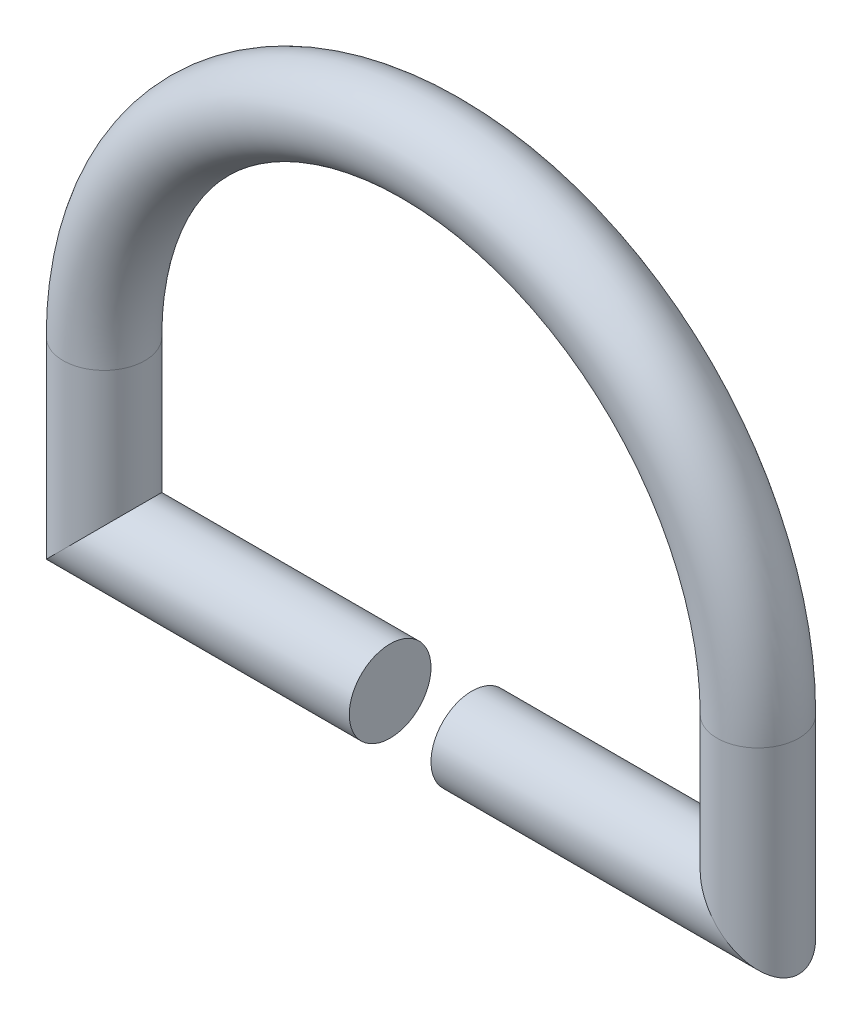
ISO-10303-21;
HEADER;
FILE_DESCRIPTION(('STEP AP214'),'2;1');
FILE_NAME('part.step','',(''),(''),'','','');
FILE_SCHEMA(('AUTOMOTIVE_DESIGN { 1 0 10303 214 1 1 1 1 }'));
ENDSEC;
DATA;
#1=APPLICATION_CONTEXT('core data for automotive mechanical design processes');
#2=APPLICATION_PROTOCOL_DEFINITION('international standard','automotive_design',2000,#1);
#3=PRODUCT_CONTEXT('',#1,'mechanical');
#4=PRODUCT('Part','Part','',(#3));
#5=PRODUCT_RELATED_PRODUCT_CATEGORY('part','',(#4));
#6=PRODUCT_DEFINITION_FORMATION('','',#4);
#7=PRODUCT_DEFINITION_CONTEXT('part definition',#1,'design');
#8=PRODUCT_DEFINITION('design','',#6,#7);
#9=PRODUCT_DEFINITION_SHAPE('','',#8);
#10=(LENGTH_UNIT() NAMED_UNIT(*) SI_UNIT(.MILLI.,.METRE.));
#11=(NAMED_UNIT(*) PLANE_ANGLE_UNIT() SI_UNIT($,.RADIAN.));
#12=(NAMED_UNIT(*) SI_UNIT($,.STERADIAN.) SOLID_ANGLE_UNIT());
#13=UNCERTAINTY_MEASURE_WITH_UNIT(LENGTH_MEASURE(1.E-05),#10,'distance_accuracy_value','');
#14=(GEOMETRIC_REPRESENTATION_CONTEXT(3) GLOBAL_UNCERTAINTY_ASSIGNED_CONTEXT((#13)) GLOBAL_UNIT_ASSIGNED_CONTEXT((#10,
#11,#12)) REPRESENTATION_CONTEXT('',''));
#15=CARTESIAN_POINT('',(0.,0.,0.));
#16=DIRECTION('',(0.,0.,1.));
#17=DIRECTION('',(1.,0.,0.));
#18=AXIS2_PLACEMENT_3D('',#15,#16,#17);
#19=CARTESIAN_POINT('',(-0.5,0.,0.));
#20=DIRECTION('',(1.,0.,0.));
#21=DIRECTION('',(0.,0.,-1.));
#22=AXIS2_PLACEMENT_3D('',#19,#20,#21);
#23=PLANE('',#22);
#24=CARTESIAN_POINT('',(-0.5,0.,0.));
#25=DIRECTION('',(1.,0.,0.));
#26=DIRECTION('',(0.,0.,-1.));
#27=AXIS2_PLACEMENT_3D('',#24,#25,#26);
#28=CIRCLE('',#27,0.5);
#29=CARTESIAN_POINT('',(-0.5,0.,-0.5));
#30=VERTEX_POINT('',#29);
#31=EDGE_CURVE('E46',#30,#30,#28,.T.);
#32=ORIENTED_EDGE('',*,*,#31,.T.);
#33=EDGE_LOOP('',(#32));
#34=FACE_BOUND('',#33,.T.);
#35=ADVANCED_FACE('F43',(#34),#23,.T.);
#36=CARTESIAN_POINT('',(0.5,0.,0.));
#37=DIRECTION('',(1.,0.,0.));
#38=DIRECTION('',(0.,0.,-1.));
#39=AXIS2_PLACEMENT_3D('',#36,#37,#38);
#40=PLANE('',#39);
#41=CARTESIAN_POINT('',(0.5,0.,0.));
#42=DIRECTION('',(1.,0.,0.));
#43=DIRECTION('',(0.,0.,-1.));
#44=AXIS2_PLACEMENT_3D('',#41,#42,#43);
#45=CIRCLE('',#44,0.5);
#46=CARTESIAN_POINT('',(0.5,0.,-0.5));
#47=VERTEX_POINT('',#46);
#48=EDGE_CURVE('E51',#47,#47,#45,.T.);
#49=ORIENTED_EDGE('',*,*,#48,.F.);
#50=EDGE_LOOP('',(#49));
#51=FACE_BOUND('',#50,.T.);
#52=ADVANCED_FACE('F79',(#51),#40,.F.);
#53=CARTESIAN_POINT('',(-5.2,0.,0.));
#54=DIRECTION('',(1.,0.,0.));
#55=DIRECTION('',(0.,0.,-1.));
#56=AXIS2_PLACEMENT_3D('',#53,#54,#55);
#57=CYLINDRICAL_SURFACE('',#56,0.5);
#58=CARTESIAN_POINT('',(-4.,0.,0.));
#59=DIRECTION('',(0.707106781186548,-0.707106781186548,0.));
#60=DIRECTION('',(-0.707106781186548,-0.707106781186548,0.));
#61=AXIS2_PLACEMENT_3D('',#58,#59,#60);
#62=ELLIPSE('',#61,0.707106781186547,0.5);
#63=CARTESIAN_POINT('',(-4.5,-0.499999999999999,0.));
#64=VERTEX_POINT('',#63);
#65=EDGE_CURVE('E64',#64,#64,#62,.F.);
#66=ORIENTED_EDGE('',*,*,#65,.F.);
#67=EDGE_LOOP('',(#66));
#68=FACE_BOUND('',#67,.T.);
#69=ORIENTED_EDGE('',*,*,#31,.F.);
#70=EDGE_LOOP('',(#69));
#71=FACE_BOUND('',#70,.T.);
#72=ADVANCED_FACE('F76',(#68,#71),#57,.T.);
#73=CARTESIAN_POINT('',(4.,-1.2,0.));
#74=DIRECTION('',(0.,1.,0.));
#75=DIRECTION('',(0.,0.,1.));
#76=AXIS2_PLACEMENT_3D('',#73,#74,#75);
#77=CYLINDRICAL_SURFACE('',#76,0.5);
#78=CARTESIAN_POINT('',(4.,0.,0.));
#79=DIRECTION('',(0.707106781186547,0.707106781186547,0.));
#80=DIRECTION('',(0.707106781186548,-0.707106781186548,0.));
#81=AXIS2_PLACEMENT_3D('',#78,#79,#80);
#82=ELLIPSE('',#81,0.707106781186548,0.5);
#83=CARTESIAN_POINT('',(4.5,-0.499999999999999,0.));
#84=VERTEX_POINT('',#83);
#85=EDGE_CURVE('E10',#84,#84,#82,.F.);
#86=ORIENTED_EDGE('',*,*,#85,.F.);
#87=EDGE_LOOP('',(#86));
#88=FACE_BOUND('',#87,.T.);
#89=CARTESIAN_POINT('',(4.,2.,0.));
#90=DIRECTION('',(0.,1.,0.));
#91=DIRECTION('',(0.,0.,-1.));
#92=AXIS2_PLACEMENT_3D('',#89,#90,#91);
#93=CIRCLE('',#92,0.5);
#94=CARTESIAN_POINT('',(4.5,2.,0.));
#95=VERTEX_POINT('',#94);
#96=EDGE_CURVE('E60',#95,#95,#93,.T.);
#97=ORIENTED_EDGE('',*,*,#96,.F.);
#98=EDGE_LOOP('',(#97));
#99=FACE_BOUND('',#98,.T.);
#100=ADVANCED_FACE('F78',(#88,#99),#77,.T.);
#101=CARTESIAN_POINT('',(0.,2.,0.));
#102=DIRECTION('',(0.,0.,1.));
#103=DIRECTION('',(1.,0.,0.));
#104=AXIS2_PLACEMENT_3D('',#101,#102,#103);
#105=TOROIDAL_SURFACE('',#104,4.,0.5);
#106=CARTESIAN_POINT('',(-4.,2.,0.));
#107=DIRECTION('',(0.,-1.,0.));
#108=DIRECTION('',(0.,0.,-1.));
#109=AXIS2_PLACEMENT_3D('',#106,#107,#108);
#110=CIRCLE('',#109,0.5);
#111=CARTESIAN_POINT('',(-4.5,2.,0.));
#112=VERTEX_POINT('',#111);
#113=EDGE_CURVE('E57',#112,#112,#110,.T.);
#114=CARTESIAN_POINT('',(0.,2.,0.));
#115=DIRECTION('',(0.,0.,1.));
#116=DIRECTION('',(1.,0.,0.));
#117=AXIS2_PLACEMENT_3D('',#114,#115,#116);
#118=CIRCLE('',#117,4.5);
#119=EDGE_CURVE('',#95,#112,#118,.T.);
#120=ORIENTED_EDGE('',*,*,#96,.T.);
#121=ORIENTED_EDGE('',*,*,#113,.F.);
#122=ORIENTED_EDGE('',*,*,#119,.T.);
#123=ORIENTED_EDGE('',*,*,#119,.F.);
#124=EDGE_LOOP('',(#120,#122,#121,#123));
#125=FACE_BOUND('',#124,.T.);
#126=ADVANCED_FACE('F86',(#125),#105,.T.);
#127=CARTESIAN_POINT('',(-4.,2.,0.));
#128=DIRECTION('',(0.,-1.,0.));
#129=DIRECTION('',(0.,0.,-1.));
#130=AXIS2_PLACEMENT_3D('',#127,#128,#129);
#131=CYLINDRICAL_SURFACE('',#130,0.5);
#132=ORIENTED_EDGE('',*,*,#113,.T.);
#133=EDGE_LOOP('',(#132));
#134=FACE_BOUND('',#133,.T.);
#135=ORIENTED_EDGE('',*,*,#65,.T.);
#136=EDGE_LOOP('',(#135));
#137=FACE_BOUND('',#136,.T.);
#138=ADVANCED_FACE('F93',(#134,#137),#131,.T.);
#139=CARTESIAN_POINT('',(0.5,0.,0.));
#140=DIRECTION('',(1.,0.,0.));
#141=DIRECTION('',(0.,0.,-1.));
#142=AXIS2_PLACEMENT_3D('',#139,#140,#141);
#143=CYLINDRICAL_SURFACE('',#142,0.5);
#144=ORIENTED_EDGE('',*,*,#48,.T.);
#145=EDGE_LOOP('',(#144));
#146=FACE_BOUND('',#145,.T.);
#147=ORIENTED_EDGE('',*,*,#85,.T.);
#148=EDGE_LOOP('',(#147));
#149=FACE_BOUND('',#148,.T.);
#150=ADVANCED_FACE('F91',(#146,#149),#143,.T.);
#151=CLOSED_SHELL('',(#35,#52,#72,#100,#126,#138,#150));
#152=MANIFOLD_SOLID_BREP('B2',#151);
#153=ADVANCED_BREP_SHAPE_REPRESENTATION('',(#18,#152),#14);
#154=SHAPE_DEFINITION_REPRESENTATION(#9,#153);
ENDSEC;
END-ISO-10303-21;
